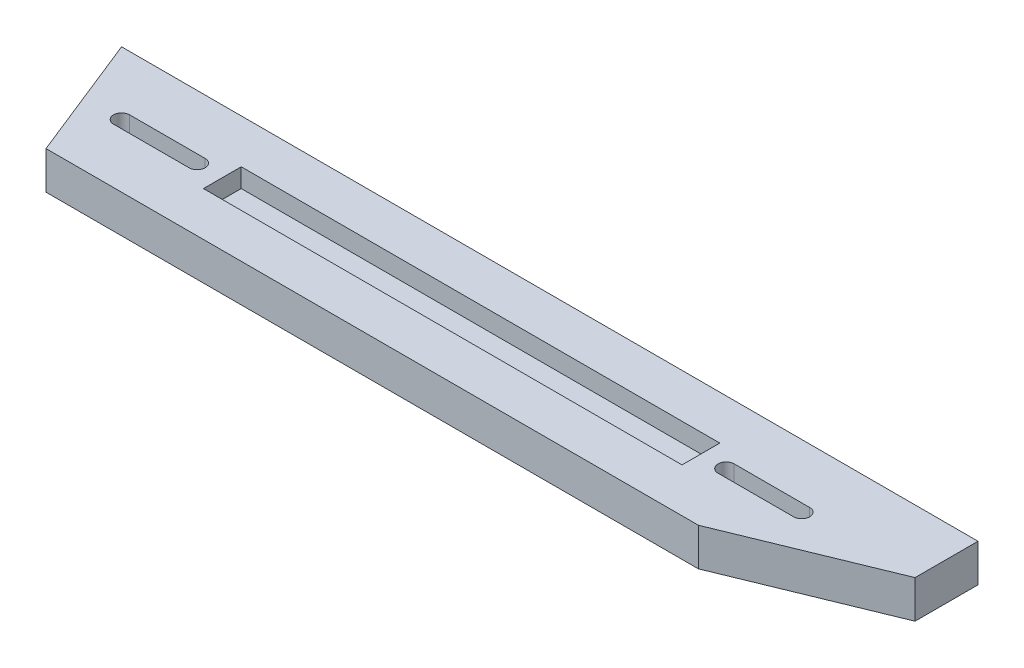
ISO-10303-21;
HEADER;
FILE_DESCRIPTION(('STEP AP214'),'2;1');
FILE_NAME('part.step','',(''),(''),'','','');
FILE_SCHEMA(('AUTOMOTIVE_DESIGN { 1 0 10303 214 1 1 1 1 }'));
ENDSEC;
DATA;
#1=APPLICATION_CONTEXT('core data for automotive mechanical design processes');
#2=APPLICATION_PROTOCOL_DEFINITION('international standard','automotive_design',2000,#1);
#3=PRODUCT_CONTEXT('',#1,'mechanical');
#4=PRODUCT('Part','Part','',(#3));
#5=PRODUCT_RELATED_PRODUCT_CATEGORY('part','',(#4));
#6=PRODUCT_DEFINITION_FORMATION('','',#4);
#7=PRODUCT_DEFINITION_CONTEXT('part definition',#1,'design');
#8=PRODUCT_DEFINITION('design','',#6,#7);
#9=PRODUCT_DEFINITION_SHAPE('','',#8);
#10=(LENGTH_UNIT() NAMED_UNIT(*) SI_UNIT(.MILLI.,.METRE.));
#11=(NAMED_UNIT(*) PLANE_ANGLE_UNIT() SI_UNIT($,.RADIAN.));
#12=(NAMED_UNIT(*) SI_UNIT($,.STERADIAN.) SOLID_ANGLE_UNIT());
#13=UNCERTAINTY_MEASURE_WITH_UNIT(LENGTH_MEASURE(1.E-05),#10,'distance_accuracy_value','');
#14=(GEOMETRIC_REPRESENTATION_CONTEXT(3) GLOBAL_UNCERTAINTY_ASSIGNED_CONTEXT((#13)) GLOBAL_UNIT_ASSIGNED_CONTEXT((#10,
#11,#12)) REPRESENTATION_CONTEXT('',''));
#15=CARTESIAN_POINT('',(0.,0.,0.));
#16=DIRECTION('',(0.,0.,1.));
#17=DIRECTION('',(1.,0.,0.));
#18=AXIS2_PLACEMENT_3D('',#15,#16,#17);
#19=CARTESIAN_POINT('',(215.9,19.05,31.75));
#20=DIRECTION('',(0.,0.,-1.));
#21=DIRECTION('',(-1.,0.,0.));
#22=AXIS2_PLACEMENT_3D('',#19,#20,#21);
#23=PLANE('',#22);
#24=DIRECTION('',(1.,0.,0.));
#25=VECTOR('',#24,1.);
#26=CARTESIAN_POINT('',(215.9,0.,31.75));
#27=LINE('',#26,#25);
#28=CARTESIAN_POINT('',(-190.5,0.,31.75));
#29=VERTEX_POINT('',#28);
#30=CARTESIAN_POINT('',(138.430000000001,0.,31.7499999999999));
#31=VERTEX_POINT('',#30);
#32=EDGE_CURVE('E288',#29,#31,#27,.T.);
#33=ORIENTED_EDGE('',*,*,#32,.T.);
#34=DIRECTION('',(0.,1.,0.));
#35=VECTOR('',#34,1.);
#36=CARTESIAN_POINT('',(138.43,0.,31.75));
#37=LINE('',#36,#35);
#38=CARTESIAN_POINT('',(138.43,19.05,31.75));
#39=VERTEX_POINT('',#38);
#40=EDGE_CURVE('E277',#31,#39,#37,.T.);
#41=ORIENTED_EDGE('',*,*,#40,.T.);
#42=DIRECTION('',(1.,0.,0.));
#43=VECTOR('',#42,1.);
#44=CARTESIAN_POINT('',(215.9,19.05,31.75));
#45=LINE('',#44,#43);
#46=CARTESIAN_POINT('',(-190.5,19.05,31.75));
#47=VERTEX_POINT('',#46);
#48=EDGE_CURVE('E289',#47,#39,#45,.T.);
#49=ORIENTED_EDGE('',*,*,#48,.F.);
#50=DIRECTION('',(0.,1.,0.));
#51=VECTOR('',#50,1.);
#52=CARTESIAN_POINT('',(-190.5,0.,31.75));
#53=LINE('',#52,#51);
#54=EDGE_CURVE('E285',#29,#47,#53,.T.);
#55=ORIENTED_EDGE('',*,*,#54,.F.);
#56=EDGE_LOOP('',(#33,#41,#49,#55));
#57=FACE_BOUND('',#56,.T.);
#58=ADVANCED_FACE('F35',(#57),#23,.F.);
#59=CARTESIAN_POINT('',(215.9,19.05,31.75));
#60=DIRECTION('',(-1.,0.,0.));
#61=DIRECTION('',(0.,0.,1.));
#62=AXIS2_PLACEMENT_3D('',#59,#60,#61);
#63=PLANE('',#62);
#64=DIRECTION('',(0.,0.,-1.));
#65=VECTOR('',#64,1.);
#66=CARTESIAN_POINT('',(215.9,19.05,31.75));
#67=LINE('',#66,#65);
#68=CARTESIAN_POINT('',(215.9,19.05,0.));
#69=VERTEX_POINT('',#68);
#70=CARTESIAN_POINT('',(215.9,19.05,-31.75));
#71=VERTEX_POINT('',#70);
#72=EDGE_CURVE('E292',#69,#71,#67,.T.);
#73=ORIENTED_EDGE('',*,*,#72,.F.);
#74=DIRECTION('',(0.,1.,0.));
#75=VECTOR('',#74,1.);
#76=CARTESIAN_POINT('',(215.9,0.,0.));
#77=LINE('',#76,#75);
#78=CARTESIAN_POINT('',(215.9,0.,0.));
#79=VERTEX_POINT('',#78);
#80=EDGE_CURVE('E275',#79,#69,#77,.T.);
#81=ORIENTED_EDGE('',*,*,#80,.F.);
#82=DIRECTION('',(0.,0.,-1.));
#83=VECTOR('',#82,1.);
#84=CARTESIAN_POINT('',(215.9,0.,31.75));
#85=LINE('',#84,#83);
#86=CARTESIAN_POINT('',(215.9,0.,-31.75));
#87=VERTEX_POINT('',#86);
#88=EDGE_CURVE('E301',#79,#87,#85,.T.);
#89=ORIENTED_EDGE('',*,*,#88,.T.);
#90=DIRECTION('',(0.,-1.,0.));
#91=VECTOR('',#90,1.);
#92=CARTESIAN_POINT('',(215.9,19.05,-31.75));
#93=LINE('',#92,#91);
#94=EDGE_CURVE('E11',#71,#87,#93,.T.);
#95=ORIENTED_EDGE('',*,*,#94,.F.);
#96=EDGE_LOOP('',(#73,#81,#89,#95));
#97=FACE_BOUND('',#96,.T.);
#98=ADVANCED_FACE('F321',(#97),#63,.F.);
#99=CARTESIAN_POINT('',(215.9,19.05,-31.75));
#100=DIRECTION('',(0.,0.,1.));
#101=DIRECTION('',(1.,0.,0.));
#102=AXIS2_PLACEMENT_3D('',#99,#100,#101);
#103=PLANE('',#102);
#104=DIRECTION('',(-1.,0.,0.));
#105=VECTOR('',#104,1.);
#106=CARTESIAN_POINT('',(215.9,0.,-31.75));
#107=LINE('',#106,#105);
#108=CARTESIAN_POINT('',(-215.9,0.,-31.75));
#109=VERTEX_POINT('',#108);
#110=EDGE_CURVE('E293',#87,#109,#107,.T.);
#111=ORIENTED_EDGE('',*,*,#110,.T.);
#112=DIRECTION('',(0.,-1.,0.));
#113=VECTOR('',#112,1.);
#114=CARTESIAN_POINT('',(-215.9,19.05,-31.75));
#115=LINE('',#114,#113);
#116=CARTESIAN_POINT('',(-215.9,19.05,-31.75));
#117=VERTEX_POINT('',#116);
#118=EDGE_CURVE('E42',#117,#109,#115,.T.);
#119=ORIENTED_EDGE('',*,*,#118,.F.);
#120=DIRECTION('',(-1.,0.,0.));
#121=VECTOR('',#120,1.);
#122=CARTESIAN_POINT('',(215.9,19.05,-31.75));
#123=LINE('',#122,#121);
#124=EDGE_CURVE('E295',#71,#117,#123,.T.);
#125=ORIENTED_EDGE('',*,*,#124,.F.);
#126=ORIENTED_EDGE('',*,*,#94,.T.);
#127=EDGE_LOOP('',(#111,#119,#125,#126));
#128=FACE_BOUND('',#127,.T.);
#129=ADVANCED_FACE('F317',(#128),#103,.F.);
#130=CARTESIAN_POINT('',(0.,19.05,0.));
#131=DIRECTION('',(0.,1.,0.));
#132=DIRECTION('',(0.,0.,1.));
#133=AXIS2_PLACEMENT_3D('',#130,#131,#132);
#134=PLANE('',#133);
#135=DIRECTION('',(0.,0.,1.));
#136=VECTOR('',#135,1.);
#137=CARTESIAN_POINT('',(-133.35,19.05,-9.52499999999999));
#138=LINE('',#137,#136);
#139=CARTESIAN_POINT('',(-133.35,19.05,-9.52499999999999));
#140=VERTEX_POINT('',#139);
#141=CARTESIAN_POINT('',(-133.35,19.05,9.52500000000001));
#142=VERTEX_POINT('',#141);
#143=EDGE_CURVE('E49',#140,#142,#138,.T.);
#144=ORIENTED_EDGE('',*,*,#143,.F.);
#145=DIRECTION('',(-1.,0.,0.));
#146=VECTOR('',#145,1.);
#147=CARTESIAN_POINT('',(-133.35,19.05,-9.52499999999999));
#148=LINE('',#147,#146);
#149=CARTESIAN_POINT('',(107.95,19.05,-9.52499999999999));
#150=VERTEX_POINT('',#149);
#151=EDGE_CURVE('E174',#150,#140,#148,.T.);
#152=ORIENTED_EDGE('',*,*,#151,.F.);
#153=DIRECTION('',(0.,0.,-1.));
#154=VECTOR('',#153,1.);
#155=CARTESIAN_POINT('',(107.95,19.05,-9.52499999999999));
#156=LINE('',#155,#154);
#157=CARTESIAN_POINT('',(107.95,19.05,9.52500000000001));
#158=VERTEX_POINT('',#157);
#159=EDGE_CURVE('E180',#158,#150,#156,.T.);
#160=ORIENTED_EDGE('',*,*,#159,.F.);
#161=DIRECTION('',(1.,0.,0.));
#162=VECTOR('',#161,1.);
#163=CARTESIAN_POINT('',(-133.35,19.05,9.52500000000001));
#164=LINE('',#163,#162);
#165=EDGE_CURVE('E187',#142,#158,#164,.T.);
#166=ORIENTED_EDGE('',*,*,#165,.F.);
#167=EDGE_LOOP('',(#144,#152,#160,#166));
#168=FACE_BOUND('',#167,.T.);
#169=CARTESIAN_POINT('',(-184.15,19.05,0.));
#170=DIRECTION('',(0.,1.,0.));
#171=DIRECTION('',(0.,0.,1.));
#172=AXIS2_PLACEMENT_3D('',#169,#170,#171);
#173=CIRCLE('',#172,4.064);
#174=CARTESIAN_POINT('',(-184.15,19.05,-4.06399999999998));
#175=VERTEX_POINT('',#174);
#176=CARTESIAN_POINT('',(-184.15,19.05,4.06400000000002));
#177=VERTEX_POINT('',#176);
#178=EDGE_CURVE('E57',#175,#177,#173,.T.);
#179=ORIENTED_EDGE('',*,*,#178,.F.);
#180=DIRECTION('',(-1.,0.,0.));
#181=VECTOR('',#180,1.);
#182=CARTESIAN_POINT('',(-184.15,19.05,-4.06399999999998));
#183=LINE('',#182,#181);
#184=CARTESIAN_POINT('',(-146.05,19.05,-4.06399999999999));
#185=VERTEX_POINT('',#184);
#186=EDGE_CURVE('E200',#185,#175,#183,.T.);
#187=ORIENTED_EDGE('',*,*,#186,.F.);
#188=CARTESIAN_POINT('',(-146.05,19.05,0.));
#189=DIRECTION('',(0.,1.,0.));
#190=DIRECTION('',(0.,0.,1.));
#191=AXIS2_PLACEMENT_3D('',#188,#189,#190);
#192=CIRCLE('',#191,4.064);
#193=CARTESIAN_POINT('',(-146.05,19.05,4.06400000000001));
#194=VERTEX_POINT('',#193);
#195=EDGE_CURVE('E218',#194,#185,#192,.T.);
#196=ORIENTED_EDGE('',*,*,#195,.F.);
#197=DIRECTION('',(1.,0.,0.));
#198=VECTOR('',#197,1.);
#199=CARTESIAN_POINT('',(-184.15,19.05,4.06400000000002));
#200=LINE('',#199,#198);
#201=EDGE_CURVE('E214',#177,#194,#200,.T.);
#202=ORIENTED_EDGE('',*,*,#201,.F.);
#203=EDGE_LOOP('',(#179,#187,#196,#202));
#204=FACE_BOUND('',#203,.T.);
#205=CARTESIAN_POINT('',(158.75,19.05,0.));
#206=DIRECTION('',(0.,1.,0.));
#207=DIRECTION('',(0.,0.,1.));
#208=AXIS2_PLACEMENT_3D('',#205,#206,#207);
#209=CIRCLE('',#208,4.064);
#210=CARTESIAN_POINT('',(158.75,19.05,4.064));
#211=VERTEX_POINT('',#210);
#212=CARTESIAN_POINT('',(158.75,19.05,-4.064));
#213=VERTEX_POINT('',#212);
#214=EDGE_CURVE('E227',#211,#213,#209,.T.);
#215=ORIENTED_EDGE('',*,*,#214,.F.);
#216=DIRECTION('',(1.,0.,0.));
#217=VECTOR('',#216,1.);
#218=CARTESIAN_POINT('',(158.75,19.05,4.064));
#219=LINE('',#218,#217);
#220=CARTESIAN_POINT('',(120.65,19.05,4.06400000000001));
#221=VERTEX_POINT('',#220);
#222=EDGE_CURVE('E237',#221,#211,#219,.T.);
#223=ORIENTED_EDGE('',*,*,#222,.F.);
#224=CARTESIAN_POINT('',(120.65,19.05,0.));
#225=DIRECTION('',(0.,1.,0.));
#226=DIRECTION('',(0.,0.,1.));
#227=AXIS2_PLACEMENT_3D('',#224,#225,#226);
#228=CIRCLE('',#227,4.064);
#229=CARTESIAN_POINT('',(120.65,19.05,-4.06399999999999));
#230=VERTEX_POINT('',#229);
#231=EDGE_CURVE('E255',#230,#221,#228,.T.);
#232=ORIENTED_EDGE('',*,*,#231,.F.);
#233=DIRECTION('',(-1.,0.,0.));
#234=VECTOR('',#233,1.);
#235=CARTESIAN_POINT('',(158.75,19.05,-4.064));
#236=LINE('',#235,#234);
#237=EDGE_CURVE('E251',#213,#230,#236,.T.);
#238=ORIENTED_EDGE('',*,*,#237,.F.);
#239=EDGE_LOOP('',(#215,#223,#232,#238));
#240=FACE_BOUND('',#239,.T.);
#241=DIRECTION('',(-0.925305138660672,0.,0.379223417483883));
#242=VECTOR('',#241,1.);
#243=CARTESIAN_POINT('',(215.9,19.05,0.));
#244=LINE('',#243,#242);
#245=EDGE_CURVE('E264',#69,#39,#244,.T.);
#246=ORIENTED_EDGE('',*,*,#245,.F.);
#247=ORIENTED_EDGE('',*,*,#72,.T.);
#248=ORIENTED_EDGE('',*,*,#124,.T.);
#249=DIRECTION('',(-0.371390676354104,0.,-0.928476690885259));
#250=VECTOR('',#249,1.);
#251=CARTESIAN_POINT('',(-215.9,19.05,-31.75));
#252=LINE('',#251,#250);
#253=EDGE_CURVE('E280',#47,#117,#252,.T.);
#254=ORIENTED_EDGE('',*,*,#253,.F.);
#255=ORIENTED_EDGE('',*,*,#48,.T.);
#256=EDGE_LOOP('',(#246,#247,#248,#254,#255));
#257=FACE_BOUND('',#256,.T.);
#258=ADVANCED_FACE('F328',(#168,#204,#240,#257),#134,.T.);
#259=CARTESIAN_POINT('',(0.,0.,0.));
#260=DIRECTION('',(0.,1.,0.));
#261=DIRECTION('',(0.,0.,1.));
#262=AXIS2_PLACEMENT_3D('',#259,#260,#261);
#263=PLANE('',#262);
#264=DIRECTION('',(-1.,0.,0.));
#265=VECTOR('',#264,1.);
#266=CARTESIAN_POINT('',(-184.15,0.,-4.06399999999998));
#267=LINE('',#266,#265);
#268=CARTESIAN_POINT('',(-146.05,0.,-4.06399999999999));
#269=VERTEX_POINT('',#268);
#270=CARTESIAN_POINT('',(-184.15,0.,-4.06399999999998));
#271=VERTEX_POINT('',#270);
#272=EDGE_CURVE('E208',#269,#271,#267,.T.);
#273=ORIENTED_EDGE('',*,*,#272,.T.);
#274=CARTESIAN_POINT('',(-184.15,0.,0.));
#275=DIRECTION('',(0.,1.,0.));
#276=DIRECTION('',(0.,0.,1.));
#277=AXIS2_PLACEMENT_3D('',#274,#275,#276);
#278=CIRCLE('',#277,4.064);
#279=CARTESIAN_POINT('',(-184.15,0.,4.06400000000002));
#280=VERTEX_POINT('',#279);
#281=EDGE_CURVE('E196',#271,#280,#278,.T.);
#282=ORIENTED_EDGE('',*,*,#281,.T.);
#283=DIRECTION('',(1.,0.,0.));
#284=VECTOR('',#283,1.);
#285=CARTESIAN_POINT('',(-184.15,0.,4.06400000000002));
#286=LINE('',#285,#284);
#287=CARTESIAN_POINT('',(-146.05,0.,4.06400000000001));
#288=VERTEX_POINT('',#287);
#289=EDGE_CURVE('E199',#280,#288,#286,.T.);
#290=ORIENTED_EDGE('',*,*,#289,.T.);
#291=CARTESIAN_POINT('',(-146.05,0.,0.));
#292=DIRECTION('',(0.,1.,0.));
#293=DIRECTION('',(0.,0.,1.));
#294=AXIS2_PLACEMENT_3D('',#291,#292,#293);
#295=CIRCLE('',#294,4.064);
#296=EDGE_CURVE('E204',#288,#269,#295,.T.);
#297=ORIENTED_EDGE('',*,*,#296,.T.);
#298=EDGE_LOOP('',(#273,#282,#290,#297));
#299=FACE_BOUND('',#298,.T.);
#300=DIRECTION('',(1.,0.,0.));
#301=VECTOR('',#300,1.);
#302=CARTESIAN_POINT('',(158.75,0.,4.064));
#303=LINE('',#302,#301);
#304=CARTESIAN_POINT('',(120.65,0.,4.06400000000001));
#305=VERTEX_POINT('',#304);
#306=CARTESIAN_POINT('',(158.75,0.,4.064));
#307=VERTEX_POINT('',#306);
#308=EDGE_CURVE('E245',#305,#307,#303,.T.);
#309=ORIENTED_EDGE('',*,*,#308,.T.);
#310=CARTESIAN_POINT('',(158.75,0.,0.));
#311=DIRECTION('',(0.,1.,0.));
#312=DIRECTION('',(0.,0.,1.));
#313=AXIS2_PLACEMENT_3D('',#310,#311,#312);
#314=CIRCLE('',#313,4.064);
#315=CARTESIAN_POINT('',(158.75,0.,-4.064));
#316=VERTEX_POINT('',#315);
#317=EDGE_CURVE('E233',#307,#316,#314,.T.);
#318=ORIENTED_EDGE('',*,*,#317,.T.);
#319=DIRECTION('',(-1.,0.,0.));
#320=VECTOR('',#319,1.);
#321=CARTESIAN_POINT('',(158.75,0.,-4.064));
#322=LINE('',#321,#320);
#323=CARTESIAN_POINT('',(120.65,0.,-4.064));
#324=VERTEX_POINT('',#323);
#325=EDGE_CURVE('E236',#316,#324,#322,.T.);
#326=ORIENTED_EDGE('',*,*,#325,.T.);
#327=CARTESIAN_POINT('',(120.65,0.,0.));
#328=DIRECTION('',(0.,1.,0.));
#329=DIRECTION('',(0.,0.,1.));
#330=AXIS2_PLACEMENT_3D('',#327,#328,#329);
#331=CIRCLE('',#330,4.064);
#332=EDGE_CURVE('E241',#324,#305,#331,.T.);
#333=ORIENTED_EDGE('',*,*,#332,.T.);
#334=EDGE_LOOP('',(#309,#318,#326,#333));
#335=FACE_BOUND('',#334,.T.);
#336=ORIENTED_EDGE('',*,*,#88,.F.);
#337=DIRECTION('',(-0.925305138660672,0.,0.379223417483883));
#338=VECTOR('',#337,1.);
#339=CARTESIAN_POINT('',(215.9,0.,0.));
#340=LINE('',#339,#338);
#341=EDGE_CURVE('E272',#79,#31,#340,.T.);
#342=ORIENTED_EDGE('',*,*,#341,.T.);
#343=ORIENTED_EDGE('',*,*,#32,.F.);
#344=DIRECTION('',(-0.371390676354104,0.,-0.928476690885259));
#345=VECTOR('',#344,1.);
#346=CARTESIAN_POINT('',(-215.9,0.,-31.75));
#347=LINE('',#346,#345);
#348=EDGE_CURVE('E282',#29,#109,#347,.T.);
#349=ORIENTED_EDGE('',*,*,#348,.T.);
#350=ORIENTED_EDGE('',*,*,#110,.F.);
#351=EDGE_LOOP('',(#336,#342,#343,#349,#350));
#352=FACE_BOUND('',#351,.T.);
#353=ADVANCED_FACE('F316',(#299,#335,#352),#263,.F.);
#354=CARTESIAN_POINT('',(-215.9,0.,-31.75));
#355=DIRECTION('',(0.928476690885259,0.,-0.371390676354104));
#356=DIRECTION('',(-0.371390676354104,0.,-0.928476690885259));
#357=AXIS2_PLACEMENT_3D('',#354,#355,#356);
#358=PLANE('',#357);
#359=ORIENTED_EDGE('',*,*,#253,.T.);
#360=ORIENTED_EDGE('',*,*,#118,.T.);
#361=ORIENTED_EDGE('',*,*,#348,.F.);
#362=ORIENTED_EDGE('',*,*,#54,.T.);
#363=EDGE_LOOP('',(#359,#360,#361,#362));
#364=FACE_BOUND('',#363,.T.);
#365=ADVANCED_FACE('F307',(#364),#358,.F.);
#366=CARTESIAN_POINT('',(215.9,0.,0.));
#367=DIRECTION('',(-0.379223417483883,0.,-0.925305138660672));
#368=DIRECTION('',(-0.925305138660672,0.,0.379223417483883));
#369=AXIS2_PLACEMENT_3D('',#366,#367,#368);
#370=PLANE('',#369);
#371=ORIENTED_EDGE('',*,*,#245,.T.);
#372=ORIENTED_EDGE('',*,*,#40,.F.);
#373=ORIENTED_EDGE('',*,*,#341,.F.);
#374=ORIENTED_EDGE('',*,*,#80,.T.);
#375=EDGE_LOOP('',(#371,#372,#373,#374));
#376=FACE_BOUND('',#375,.T.);
#377=ADVANCED_FACE('F329',(#376),#370,.F.);
#378=CARTESIAN_POINT('',(158.75,0.,0.));
#379=DIRECTION('',(0.,1.,0.));
#380=DIRECTION('',(0.,0.,1.));
#381=AXIS2_PLACEMENT_3D('',#378,#379,#380);
#382=CYLINDRICAL_SURFACE('',#381,4.064);
#383=ORIENTED_EDGE('',*,*,#214,.T.);
#384=DIRECTION('',(0.,1.,0.));
#385=VECTOR('',#384,1.);
#386=CARTESIAN_POINT('',(158.75,0.,-4.064));
#387=LINE('',#386,#385);
#388=EDGE_CURVE('E249',#316,#213,#387,.T.);
#389=ORIENTED_EDGE('',*,*,#388,.F.);
#390=ORIENTED_EDGE('',*,*,#317,.F.);
#391=DIRECTION('',(0.,1.,0.));
#392=VECTOR('',#391,1.);
#393=CARTESIAN_POINT('',(158.75,0.,4.064));
#394=LINE('',#393,#392);
#395=EDGE_CURVE('E262',#307,#211,#394,.T.);
#396=ORIENTED_EDGE('',*,*,#395,.T.);
#397=EDGE_LOOP('',(#383,#389,#390,#396));
#398=FACE_BOUND('',#397,.T.);
#399=ADVANCED_FACE('F331',(#398),#382,.F.);
#400=CARTESIAN_POINT('',(158.75,0.,4.064));
#401=DIRECTION('',(0.,0.,1.));
#402=DIRECTION('',(1.,0.,0.));
#403=AXIS2_PLACEMENT_3D('',#400,#401,#402);
#404=PLANE('',#403);
#405=ORIENTED_EDGE('',*,*,#222,.T.);
#406=ORIENTED_EDGE('',*,*,#395,.F.);
#407=ORIENTED_EDGE('',*,*,#308,.F.);
#408=DIRECTION('',(0.,1.,0.));
#409=VECTOR('',#408,1.);
#410=CARTESIAN_POINT('',(120.65,0.,4.06400000000001));
#411=LINE('',#410,#409);
#412=EDGE_CURVE('E265',#305,#221,#411,.T.);
#413=ORIENTED_EDGE('',*,*,#412,.T.);
#414=EDGE_LOOP('',(#405,#406,#407,#413));
#415=FACE_BOUND('',#414,.T.);
#416=ADVANCED_FACE('F337',(#415),#404,.F.);
#417=CARTESIAN_POINT('',(120.65,0.,0.));
#418=DIRECTION('',(0.,1.,0.));
#419=DIRECTION('',(0.,0.,1.));
#420=AXIS2_PLACEMENT_3D('',#417,#418,#419);
#421=CYLINDRICAL_SURFACE('',#420,4.064);
#422=ORIENTED_EDGE('',*,*,#231,.T.);
#423=ORIENTED_EDGE('',*,*,#412,.F.);
#424=ORIENTED_EDGE('',*,*,#332,.F.);
#425=DIRECTION('',(0.,1.,0.));
#426=VECTOR('',#425,1.);
#427=CARTESIAN_POINT('',(120.65,0.,-4.06399999999999));
#428=LINE('',#427,#426);
#429=EDGE_CURVE('E267',#324,#230,#428,.T.);
#430=ORIENTED_EDGE('',*,*,#429,.T.);
#431=EDGE_LOOP('',(#422,#423,#424,#430));
#432=FACE_BOUND('',#431,.T.);
#433=ADVANCED_FACE('F375',(#432),#421,.F.);
#434=CARTESIAN_POINT('',(158.75,0.,-4.064));
#435=DIRECTION('',(0.,0.,-1.));
#436=DIRECTION('',(-1.,0.,0.));
#437=AXIS2_PLACEMENT_3D('',#434,#435,#436);
#438=PLANE('',#437);
#439=ORIENTED_EDGE('',*,*,#237,.T.);
#440=ORIENTED_EDGE('',*,*,#429,.F.);
#441=ORIENTED_EDGE('',*,*,#325,.F.);
#442=ORIENTED_EDGE('',*,*,#388,.T.);
#443=EDGE_LOOP('',(#439,#440,#441,#442));
#444=FACE_BOUND('',#443,.T.);
#445=ADVANCED_FACE('F369',(#444),#438,.F.);
#446=CARTESIAN_POINT('',(-184.15,0.,0.));
#447=DIRECTION('',(0.,1.,0.));
#448=DIRECTION('',(0.,0.,1.));
#449=AXIS2_PLACEMENT_3D('',#446,#447,#448);
#450=CYLINDRICAL_SURFACE('',#449,4.064);
#451=ORIENTED_EDGE('',*,*,#178,.T.);
#452=DIRECTION('',(0.,1.,0.));
#453=VECTOR('',#452,1.);
#454=CARTESIAN_POINT('',(-184.15,0.,4.06400000000002));
#455=LINE('',#454,#453);
#456=EDGE_CURVE('E212',#280,#177,#455,.T.);
#457=ORIENTED_EDGE('',*,*,#456,.F.);
#458=ORIENTED_EDGE('',*,*,#281,.F.);
#459=DIRECTION('',(0.,1.,0.));
#460=VECTOR('',#459,1.);
#461=CARTESIAN_POINT('',(-184.15,0.,-4.06399999999998));
#462=LINE('',#461,#460);
#463=EDGE_CURVE('E225',#271,#175,#462,.T.);
#464=ORIENTED_EDGE('',*,*,#463,.T.);
#465=EDGE_LOOP('',(#451,#457,#458,#464));
#466=FACE_BOUND('',#465,.T.);
#467=ADVANCED_FACE('F382',(#466),#450,.F.);
#468=CARTESIAN_POINT('',(-184.15,0.,-4.06399999999998));
#469=DIRECTION('',(0.,0.,-1.));
#470=DIRECTION('',(-1.,0.,0.));
#471=AXIS2_PLACEMENT_3D('',#468,#469,#470);
#472=PLANE('',#471);
#473=ORIENTED_EDGE('',*,*,#186,.T.);
#474=ORIENTED_EDGE('',*,*,#463,.F.);
#475=ORIENTED_EDGE('',*,*,#272,.F.);
#476=DIRECTION('',(0.,1.,0.));
#477=VECTOR('',#476,1.);
#478=CARTESIAN_POINT('',(-146.05,0.,-4.06399999999999));
#479=LINE('',#478,#477);
#480=EDGE_CURVE('E228',#269,#185,#479,.T.);
#481=ORIENTED_EDGE('',*,*,#480,.T.);
#482=EDGE_LOOP('',(#473,#474,#475,#481));
#483=FACE_BOUND('',#482,.T.);
#484=ADVANCED_FACE('F388',(#483),#472,.F.);
#485=CARTESIAN_POINT('',(-146.05,0.,0.));
#486=DIRECTION('',(0.,1.,0.));
#487=DIRECTION('',(0.,0.,1.));
#488=AXIS2_PLACEMENT_3D('',#485,#486,#487);
#489=CYLINDRICAL_SURFACE('',#488,4.064);
#490=ORIENTED_EDGE('',*,*,#195,.T.);
#491=ORIENTED_EDGE('',*,*,#480,.F.);
#492=ORIENTED_EDGE('',*,*,#296,.F.);
#493=DIRECTION('',(0.,1.,0.));
#494=VECTOR('',#493,1.);
#495=CARTESIAN_POINT('',(-146.05,0.,4.06400000000001));
#496=LINE('',#495,#494);
#497=EDGE_CURVE('E230',#288,#194,#496,.T.);
#498=ORIENTED_EDGE('',*,*,#497,.T.);
#499=EDGE_LOOP('',(#490,#491,#492,#498));
#500=FACE_BOUND('',#499,.T.);
#501=ADVANCED_FACE('F392',(#500),#489,.F.);
#502=CARTESIAN_POINT('',(-184.15,0.,4.06400000000002));
#503=DIRECTION('',(0.,0.,1.));
#504=DIRECTION('',(1.,0.,0.));
#505=AXIS2_PLACEMENT_3D('',#502,#503,#504);
#506=PLANE('',#505);
#507=ORIENTED_EDGE('',*,*,#201,.T.);
#508=ORIENTED_EDGE('',*,*,#497,.F.);
#509=ORIENTED_EDGE('',*,*,#289,.F.);
#510=ORIENTED_EDGE('',*,*,#456,.T.);
#511=EDGE_LOOP('',(#507,#508,#509,#510));
#512=FACE_BOUND('',#511,.T.);
#513=ADVANCED_FACE('F389',(#512),#506,.F.);
#514=CARTESIAN_POINT('',(-133.35,9.525,-9.52499999999999));
#515=DIRECTION('',(-1.,0.,0.));
#516=DIRECTION('',(0.,0.,1.));
#517=AXIS2_PLACEMENT_3D('',#514,#515,#516);
#518=PLANE('',#517);
#519=ORIENTED_EDGE('',*,*,#143,.T.);
#520=DIRECTION('',(0.,1.,0.));
#521=VECTOR('',#520,1.);
#522=CARTESIAN_POINT('',(-133.35,9.525,9.52500000000001));
#523=LINE('',#522,#521);
#524=CARTESIAN_POINT('',(-133.35,9.525,9.52500000000001));
#525=VERTEX_POINT('',#524);
#526=EDGE_CURVE('E151',#525,#142,#523,.T.);
#527=ORIENTED_EDGE('',*,*,#526,.F.);
#528=DIRECTION('',(0.,0.,1.));
#529=VECTOR('',#528,1.);
#530=CARTESIAN_POINT('',(-133.35,9.525,-9.52499999999999));
#531=LINE('',#530,#529);
#532=CARTESIAN_POINT('',(-133.35,9.525,-9.52499999999999));
#533=VERTEX_POINT('',#532);
#534=EDGE_CURVE('E155',#533,#525,#531,.T.);
#535=ORIENTED_EDGE('',*,*,#534,.F.);
#536=DIRECTION('',(0.,1.,0.));
#537=VECTOR('',#536,1.);
#538=CARTESIAN_POINT('',(-133.35,9.525,-9.52499999999999));
#539=LINE('',#538,#537);
#540=EDGE_CURVE('E191',#533,#140,#539,.T.);
#541=ORIENTED_EDGE('',*,*,#540,.T.);
#542=EDGE_LOOP('',(#519,#527,#535,#541));
#543=FACE_BOUND('',#542,.T.);
#544=ADVANCED_FACE('F153',(#543),#518,.F.);
#545=CARTESIAN_POINT('',(-133.35,9.525,-9.52499999999999));
#546=DIRECTION('',(0.,0.,-1.));
#547=DIRECTION('',(-1.,0.,0.));
#548=AXIS2_PLACEMENT_3D('',#545,#546,#547);
#549=PLANE('',#548);
#550=ORIENTED_EDGE('',*,*,#151,.T.);
#551=ORIENTED_EDGE('',*,*,#540,.F.);
#552=DIRECTION('',(-1.,0.,0.));
#553=VECTOR('',#552,1.);
#554=CARTESIAN_POINT('',(-133.35,9.525,-9.52499999999999));
#555=LINE('',#554,#553);
#556=CARTESIAN_POINT('',(107.95,9.525,-9.52499999999999));
#557=VERTEX_POINT('',#556);
#558=EDGE_CURVE('E161',#557,#533,#555,.T.);
#559=ORIENTED_EDGE('',*,*,#558,.F.);
#560=DIRECTION('',(0.,1.,0.));
#561=VECTOR('',#560,1.);
#562=CARTESIAN_POINT('',(107.95,9.525,-9.52499999999999));
#563=LINE('',#562,#561);
#564=EDGE_CURVE('E193',#557,#150,#563,.T.);
#565=ORIENTED_EDGE('',*,*,#564,.T.);
#566=EDGE_LOOP('',(#550,#551,#559,#565));
#567=FACE_BOUND('',#566,.T.);
#568=ADVANCED_FACE('F402',(#567),#549,.F.);
#569=CARTESIAN_POINT('',(107.95,9.525,-9.52499999999999));
#570=DIRECTION('',(1.,0.,0.));
#571=DIRECTION('',(0.,0.,-1.));
#572=AXIS2_PLACEMENT_3D('',#569,#570,#571);
#573=PLANE('',#572);
#574=ORIENTED_EDGE('',*,*,#159,.T.);
#575=ORIENTED_EDGE('',*,*,#564,.F.);
#576=DIRECTION('',(0.,0.,-1.));
#577=VECTOR('',#576,1.);
#578=CARTESIAN_POINT('',(107.95,9.525,-9.52499999999999));
#579=LINE('',#578,#577);
#580=CARTESIAN_POINT('',(107.95,9.525,9.52500000000001));
#581=VERTEX_POINT('',#580);
#582=EDGE_CURVE('E169',#581,#557,#579,.T.);
#583=ORIENTED_EDGE('',*,*,#582,.F.);
#584=DIRECTION('',(0.,1.,0.));
#585=VECTOR('',#584,1.);
#586=CARTESIAN_POINT('',(107.95,9.525,9.52500000000001));
#587=LINE('',#586,#585);
#588=EDGE_CURVE('E160',#581,#158,#587,.T.);
#589=ORIENTED_EDGE('',*,*,#588,.T.);
#590=EDGE_LOOP('',(#574,#575,#583,#589));
#591=FACE_BOUND('',#590,.T.);
#592=ADVANCED_FACE('F405',(#591),#573,.F.);
#593=CARTESIAN_POINT('',(-133.35,9.525,9.52500000000001));
#594=DIRECTION('',(0.,0.,1.));
#595=DIRECTION('',(1.,0.,0.));
#596=AXIS2_PLACEMENT_3D('',#593,#594,#595);
#597=PLANE('',#596);
#598=ORIENTED_EDGE('',*,*,#165,.T.);
#599=ORIENTED_EDGE('',*,*,#588,.F.);
#600=DIRECTION('',(1.,0.,0.));
#601=VECTOR('',#600,1.);
#602=CARTESIAN_POINT('',(-133.35,9.525,9.52500000000001));
#603=LINE('',#602,#601);
#604=EDGE_CURVE('E164',#525,#581,#603,.T.);
#605=ORIENTED_EDGE('',*,*,#604,.F.);
#606=ORIENTED_EDGE('',*,*,#526,.T.);
#607=EDGE_LOOP('',(#598,#599,#605,#606));
#608=FACE_BOUND('',#607,.T.);
#609=ADVANCED_FACE('F165',(#608),#597,.F.);
#610=CARTESIAN_POINT('',(0.,9.525,0.));
#611=DIRECTION('',(0.,1.,0.));
#612=DIRECTION('',(0.,0.,1.));
#613=AXIS2_PLACEMENT_3D('',#610,#611,#612);
#614=PLANE('',#613);
#615=ORIENTED_EDGE('',*,*,#534,.T.);
#616=ORIENTED_EDGE('',*,*,#604,.T.);
#617=ORIENTED_EDGE('',*,*,#582,.T.);
#618=ORIENTED_EDGE('',*,*,#558,.T.);
#619=EDGE_LOOP('',(#615,#616,#617,#618));
#620=FACE_BOUND('',#619,.T.);
#621=ADVANCED_FACE('F171',(#620),#614,.T.);
#622=CLOSED_SHELL('',(#58,#98,#129,#258,#353,#365,#377,#399,#416,#433,#445,#467,#484,#501,#513,
#544,#568,#592,#609,#621));
#623=MANIFOLD_SOLID_BREP('B2',#622);
#624=ADVANCED_BREP_SHAPE_REPRESENTATION('',(#18,#623),#14);
#625=SHAPE_DEFINITION_REPRESENTATION(#9,#624);
ENDSEC;
END-ISO-10303-21;
